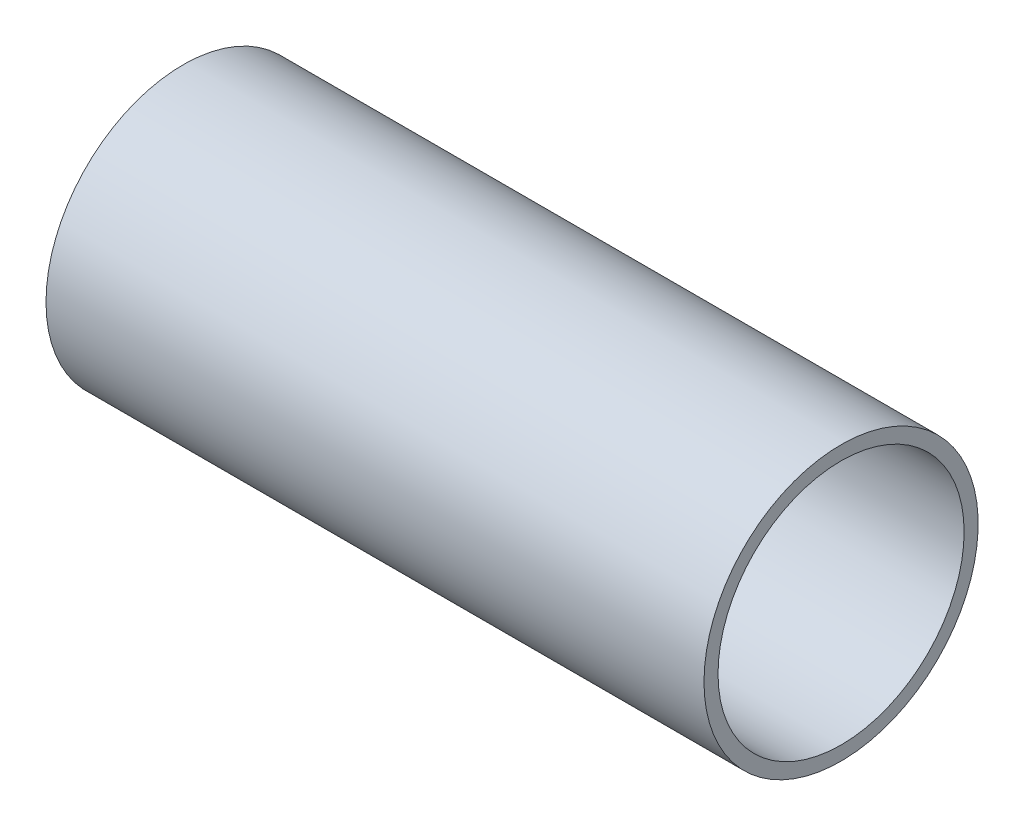
ISO-10303-21;
HEADER;
FILE_DESCRIPTION(('STEP AP214'),'2;1');
FILE_NAME('part.step','',(''),(''),'','','');
FILE_SCHEMA(('AUTOMOTIVE_DESIGN { 1 0 10303 214 1 1 1 1 }'));
ENDSEC;
DATA;
#1=APPLICATION_CONTEXT('core data for automotive mechanical design processes');
#2=APPLICATION_PROTOCOL_DEFINITION('international standard','automotive_design',2000,#1);
#3=PRODUCT_CONTEXT('',#1,'mechanical');
#4=PRODUCT('Part','Part','',(#3));
#5=PRODUCT_RELATED_PRODUCT_CATEGORY('part','',(#4));
#6=PRODUCT_DEFINITION_FORMATION('','',#4);
#7=PRODUCT_DEFINITION_CONTEXT('part definition',#1,'design');
#8=PRODUCT_DEFINITION('design','',#6,#7);
#9=PRODUCT_DEFINITION_SHAPE('','',#8);
#10=(LENGTH_UNIT() NAMED_UNIT(*) SI_UNIT(.MILLI.,.METRE.));
#11=(NAMED_UNIT(*) PLANE_ANGLE_UNIT() SI_UNIT($,.RADIAN.));
#12=(NAMED_UNIT(*) SI_UNIT($,.STERADIAN.) SOLID_ANGLE_UNIT());
#13=UNCERTAINTY_MEASURE_WITH_UNIT(LENGTH_MEASURE(1.E-05),#10,'distance_accuracy_value','');
#14=(GEOMETRIC_REPRESENTATION_CONTEXT(3) GLOBAL_UNCERTAINTY_ASSIGNED_CONTEXT((#13)) GLOBAL_UNIT_ASSIGNED_CONTEXT((#10,
#11,#12)) REPRESENTATION_CONTEXT('',''));
#15=CARTESIAN_POINT('',(0.,0.,0.));
#16=DIRECTION('',(0.,0.,1.));
#17=DIRECTION('',(1.,0.,0.));
#18=AXIS2_PLACEMENT_3D('',#15,#16,#17);
#19=CARTESIAN_POINT('',(76.2,0.,0.));
#20=DIRECTION('',(1.,0.,0.));
#21=DIRECTION('',(0.,0.,-1.));
#22=AXIS2_PLACEMENT_3D('',#19,#20,#21);
#23=PLANE('',#22);
#24=CARTESIAN_POINT('',(76.2,0.,0.));
#25=DIRECTION('',(1.,0.,0.));
#26=DIRECTION('',(0.,0.,-1.));
#27=AXIS2_PLACEMENT_3D('',#24,#25,#26);
#28=CIRCLE('',#27,15.875);
#29=CARTESIAN_POINT('',(76.2,0.,15.875));
#30=VERTEX_POINT('',#29);
#31=EDGE_CURVE('E10',#30,#30,#28,.T.);
#32=ORIENTED_EDGE('',*,*,#31,.T.);
#33=EDGE_LOOP('',(#32));
#34=FACE_BOUND('',#33,.T.);
#35=CARTESIAN_POINT('',(76.2,0.,0.));
#36=DIRECTION('',(1.,0.,0.));
#37=DIRECTION('',(0.,0.,-1.));
#38=AXIS2_PLACEMENT_3D('',#35,#36,#37);
#39=CIRCLE('',#38,14.25);
#40=CARTESIAN_POINT('',(76.2,0.,14.25));
#41=VERTEX_POINT('',#40);
#42=EDGE_CURVE('E44',#41,#41,#39,.T.);
#43=ORIENTED_EDGE('',*,*,#42,.F.);
#44=EDGE_LOOP('',(#43));
#45=FACE_BOUND('',#44,.T.);
#46=ADVANCED_FACE('F32',(#34,#45),#23,.T.);
#47=CARTESIAN_POINT('',(0.,0.,0.));
#48=DIRECTION('',(1.,0.,0.));
#49=DIRECTION('',(0.,0.,-1.));
#50=AXIS2_PLACEMENT_3D('',#47,#48,#49);
#51=PLANE('',#50);
#52=CARTESIAN_POINT('',(0.,0.,0.));
#53=DIRECTION('',(1.,0.,0.));
#54=DIRECTION('',(0.,0.,-1.));
#55=AXIS2_PLACEMENT_3D('',#52,#53,#54);
#56=CIRCLE('',#55,15.875);
#57=CARTESIAN_POINT('',(0.,0.,15.875));
#58=VERTEX_POINT('',#57);
#59=EDGE_CURVE('E36',#58,#58,#56,.T.);
#60=ORIENTED_EDGE('',*,*,#59,.F.);
#61=EDGE_LOOP('',(#60));
#62=FACE_BOUND('',#61,.T.);
#63=CARTESIAN_POINT('',(0.,0.,0.));
#64=DIRECTION('',(1.,0.,0.));
#65=DIRECTION('',(0.,0.,-1.));
#66=AXIS2_PLACEMENT_3D('',#63,#64,#65);
#67=CIRCLE('',#66,14.25);
#68=CARTESIAN_POINT('',(0.,0.,14.25));
#69=VERTEX_POINT('',#68);
#70=EDGE_CURVE('E46',#69,#69,#67,.T.);
#71=ORIENTED_EDGE('',*,*,#70,.T.);
#72=EDGE_LOOP('',(#71));
#73=FACE_BOUND('',#72,.T.);
#74=ADVANCED_FACE('F60',(#62,#73),#51,.F.);
#75=CARTESIAN_POINT('',(76.2,0.,0.));
#76=DIRECTION('',(-1.,0.,0.));
#77=DIRECTION('',(0.,0.,1.));
#78=AXIS2_PLACEMENT_3D('',#75,#76,#77);
#79=CYLINDRICAL_SURFACE('',#78,15.875);
#80=CARTESIAN_POINT('',(76.2,0.,15.875));
#81=CARTESIAN_POINT('',(75.40625,0.,15.875));
#82=CARTESIAN_POINT('',(74.6125,0.,15.875));
#83=CARTESIAN_POINT('',(73.025,0.,15.875));
#84=CARTESIAN_POINT('',(72.23125,0.,15.875));
#85=CARTESIAN_POINT('',(70.64375,0.,15.875));
#86=CARTESIAN_POINT('',(69.85,0.,15.875));
#87=CARTESIAN_POINT('',(68.2625,0.,15.875));
#88=CARTESIAN_POINT('',(67.46875,0.,15.875));
#89=CARTESIAN_POINT('',(65.88125,0.,15.875));
#90=CARTESIAN_POINT('',(65.0875,0.,15.875));
#91=CARTESIAN_POINT('',(63.5,0.,15.875));
#92=CARTESIAN_POINT('',(62.70625,0.,15.875));
#93=CARTESIAN_POINT('',(61.11875,0.,15.875));
#94=CARTESIAN_POINT('',(60.325,0.,15.875));
#95=CARTESIAN_POINT('',(58.7375,0.,15.875));
#96=CARTESIAN_POINT('',(57.94375,0.,15.875));
#97=CARTESIAN_POINT('',(56.35625,0.,15.875));
#98=CARTESIAN_POINT('',(55.5625,0.,15.875));
#99=CARTESIAN_POINT('',(53.975,0.,15.875));
#100=CARTESIAN_POINT('',(53.18125,0.,15.875));
#101=CARTESIAN_POINT('',(51.59375,0.,15.875));
#102=CARTESIAN_POINT('',(50.8,0.,15.875));
#103=CARTESIAN_POINT('',(49.2125,0.,15.875));
#104=CARTESIAN_POINT('',(48.41875,0.,15.875));
#105=CARTESIAN_POINT('',(46.83125,0.,15.875));
#106=CARTESIAN_POINT('',(46.0375,0.,15.875));
#107=CARTESIAN_POINT('',(44.45,0.,15.875));
#108=CARTESIAN_POINT('',(43.65625,0.,15.875));
#109=CARTESIAN_POINT('',(42.06875,0.,15.875));
#110=CARTESIAN_POINT('',(41.275,0.,15.875));
#111=CARTESIAN_POINT('',(39.6875,0.,15.875));
#112=CARTESIAN_POINT('',(38.89375,0.,15.875));
#113=CARTESIAN_POINT('',(37.30625,0.,15.875));
#114=CARTESIAN_POINT('',(36.5125,0.,15.875));
#115=CARTESIAN_POINT('',(34.925,0.,15.875));
#116=CARTESIAN_POINT('',(34.13125,0.,15.875));
#117=CARTESIAN_POINT('',(32.54375,0.,15.875));
#118=CARTESIAN_POINT('',(31.75,0.,15.875));
#119=CARTESIAN_POINT('',(30.1625,0.,15.875));
#120=CARTESIAN_POINT('',(29.36875,0.,15.875));
#121=CARTESIAN_POINT('',(27.78125,0.,15.875));
#122=CARTESIAN_POINT('',(26.9875,0.,15.875));
#123=CARTESIAN_POINT('',(25.4,0.,15.875));
#124=CARTESIAN_POINT('',(24.60625,0.,15.875));
#125=CARTESIAN_POINT('',(23.01875,0.,15.875));
#126=CARTESIAN_POINT('',(22.225,0.,15.875));
#127=CARTESIAN_POINT('',(20.6375,0.,15.875));
#128=CARTESIAN_POINT('',(19.84375,0.,15.875));
#129=CARTESIAN_POINT('',(18.25625,0.,15.875));
#130=CARTESIAN_POINT('',(17.4625,0.,15.875));
#131=CARTESIAN_POINT('',(15.875,0.,15.875));
#132=CARTESIAN_POINT('',(15.08125,0.,15.875));
#133=CARTESIAN_POINT('',(13.49375,0.,15.875));
#134=CARTESIAN_POINT('',(12.7,0.,15.875));
#135=CARTESIAN_POINT('',(11.1125,0.,15.875));
#136=CARTESIAN_POINT('',(10.31875,0.,15.875));
#137=CARTESIAN_POINT('',(8.73125,0.,15.875));
#138=CARTESIAN_POINT('',(7.93750000000001,0.,15.875));
#139=CARTESIAN_POINT('',(6.35,0.,15.875));
#140=CARTESIAN_POINT('',(5.55625,0.,15.875));
#141=CARTESIAN_POINT('',(3.96875,0.,15.875));
#142=CARTESIAN_POINT('',(3.175,0.,15.875));
#143=CARTESIAN_POINT('',(1.5875,0.,15.875));
#144=CARTESIAN_POINT('',(0.793750000000001,0.,15.875));
#145=CARTESIAN_POINT('',(0.,0.,15.875));
#146=B_SPLINE_CURVE_WITH_KNOTS('',3,(#80,#81,#82,#83,#84,#85,#86,#87,#88,#89,#90,#91,#92,#93,
#94,#95,#96,#97,#98,#99,#100,#101,#102,#103,#104,#105,#106,#107,#108,#109,#110,#111,#112,#113,
#114,#115,#116,#117,#118,#119,#120,#121,#122,#123,#124,#125,#126,#127,#128,#129,#130,#131,#132,
#133,#134,#135,#136,#137,#138,#139,#140,#141,#142,#143,#144,#145),.UNSPECIFIED.,.F.,.F.,(4,2,2,
2,2,2,2,2,2,2,2,2,2,2,2,2,2,2,2,2,2,2,2,2,2,2,2,2,2,2,2,2,4),(0.,2.38125,4.7625,7.14375,
9.52500000000001,11.90625,14.2875,16.66875,19.05,21.43125,23.8125,26.19375,28.575,30.95625,
33.3375,35.71875,38.1,40.48125,42.8625,45.24375,47.625,50.00625,52.3875,54.76875,57.15,59.53125,
61.9125,64.29375,66.675,69.05625,71.4375,73.81875,76.2),.UNSPECIFIED.);
#147=EDGE_CURVE('BSEAM34',#30,#58,#146,.T.);
#148=ORIENTED_EDGE('',*,*,#31,.F.);
#149=ORIENTED_EDGE('',*,*,#59,.T.);
#150=ORIENTED_EDGE('',*,*,#147,.T.);
#151=ORIENTED_EDGE('',*,*,#147,.F.);
#152=EDGE_LOOP('',(#148,#150,#149,#151));
#153=FACE_BOUND('',#152,.T.);
#154=ADVANCED_FACE('F34',(#153),#79,.T.);
#155=CARTESIAN_POINT('',(76.2,0.,0.));
#156=DIRECTION('',(-1.,0.,0.));
#157=DIRECTION('',(0.,0.,1.));
#158=AXIS2_PLACEMENT_3D('',#155,#156,#157);
#159=CYLINDRICAL_SURFACE('',#158,14.25);
#160=CARTESIAN_POINT('',(76.2,0.,14.25));
#161=CARTESIAN_POINT('',(75.40625,0.,14.25));
#162=CARTESIAN_POINT('',(74.6125,0.,14.25));
#163=CARTESIAN_POINT('',(73.025,0.,14.25));
#164=CARTESIAN_POINT('',(72.23125,0.,14.25));
#165=CARTESIAN_POINT('',(70.64375,0.,14.25));
#166=CARTESIAN_POINT('',(69.85,0.,14.25));
#167=CARTESIAN_POINT('',(68.2625,0.,14.25));
#168=CARTESIAN_POINT('',(67.46875,0.,14.25));
#169=CARTESIAN_POINT('',(65.88125,0.,14.25));
#170=CARTESIAN_POINT('',(65.0875,0.,14.25));
#171=CARTESIAN_POINT('',(63.5,0.,14.25));
#172=CARTESIAN_POINT('',(62.70625,0.,14.25));
#173=CARTESIAN_POINT('',(61.11875,0.,14.25));
#174=CARTESIAN_POINT('',(60.325,0.,14.25));
#175=CARTESIAN_POINT('',(58.7375,0.,14.25));
#176=CARTESIAN_POINT('',(57.94375,0.,14.25));
#177=CARTESIAN_POINT('',(56.35625,0.,14.25));
#178=CARTESIAN_POINT('',(55.5625,0.,14.25));
#179=CARTESIAN_POINT('',(53.975,0.,14.25));
#180=CARTESIAN_POINT('',(53.18125,0.,14.25));
#181=CARTESIAN_POINT('',(51.59375,0.,14.25));
#182=CARTESIAN_POINT('',(50.8,0.,14.25));
#183=CARTESIAN_POINT('',(49.2125,0.,14.25));
#184=CARTESIAN_POINT('',(48.41875,0.,14.25));
#185=CARTESIAN_POINT('',(46.83125,0.,14.25));
#186=CARTESIAN_POINT('',(46.0375,0.,14.25));
#187=CARTESIAN_POINT('',(44.45,0.,14.25));
#188=CARTESIAN_POINT('',(43.65625,0.,14.25));
#189=CARTESIAN_POINT('',(42.06875,0.,14.25));
#190=CARTESIAN_POINT('',(41.275,0.,14.25));
#191=CARTESIAN_POINT('',(39.6875,0.,14.25));
#192=CARTESIAN_POINT('',(38.89375,0.,14.25));
#193=CARTESIAN_POINT('',(37.30625,0.,14.25));
#194=CARTESIAN_POINT('',(36.5125,0.,14.25));
#195=CARTESIAN_POINT('',(34.925,0.,14.25));
#196=CARTESIAN_POINT('',(34.13125,0.,14.25));
#197=CARTESIAN_POINT('',(32.54375,0.,14.25));
#198=CARTESIAN_POINT('',(31.75,0.,14.25));
#199=CARTESIAN_POINT('',(30.1625,0.,14.25));
#200=CARTESIAN_POINT('',(29.36875,0.,14.25));
#201=CARTESIAN_POINT('',(27.78125,0.,14.25));
#202=CARTESIAN_POINT('',(26.9875,0.,14.25));
#203=CARTESIAN_POINT('',(25.4,0.,14.25));
#204=CARTESIAN_POINT('',(24.60625,0.,14.25));
#205=CARTESIAN_POINT('',(23.01875,0.,14.25));
#206=CARTESIAN_POINT('',(22.225,0.,14.25));
#207=CARTESIAN_POINT('',(20.6375,0.,14.25));
#208=CARTESIAN_POINT('',(19.84375,0.,14.25));
#209=CARTESIAN_POINT('',(18.25625,0.,14.25));
#210=CARTESIAN_POINT('',(17.4625,0.,14.25));
#211=CARTESIAN_POINT('',(15.875,0.,14.25));
#212=CARTESIAN_POINT('',(15.08125,0.,14.25));
#213=CARTESIAN_POINT('',(13.49375,0.,14.25));
#214=CARTESIAN_POINT('',(12.7,0.,14.25));
#215=CARTESIAN_POINT('',(11.1125,0.,14.25));
#216=CARTESIAN_POINT('',(10.31875,0.,14.25));
#217=CARTESIAN_POINT('',(8.73125,0.,14.25));
#218=CARTESIAN_POINT('',(7.93750000000001,0.,14.25));
#219=CARTESIAN_POINT('',(6.35,0.,14.25));
#220=CARTESIAN_POINT('',(5.55625,0.,14.25));
#221=CARTESIAN_POINT('',(3.96875,0.,14.25));
#222=CARTESIAN_POINT('',(3.175,0.,14.25));
#223=CARTESIAN_POINT('',(1.5875,0.,14.25));
#224=CARTESIAN_POINT('',(0.793750000000001,0.,14.25));
#225=CARTESIAN_POINT('',(0.,0.,14.25));
#226=B_SPLINE_CURVE_WITH_KNOTS('',3,(#160,#161,#162,#163,#164,#165,#166,#167,#168,#169,#170,
#171,#172,#173,#174,#175,#176,#177,#178,#179,#180,#181,#182,#183,#184,#185,#186,#187,#188,#189,
#190,#191,#192,#193,#194,#195,#196,#197,#198,#199,#200,#201,#202,#203,#204,#205,#206,#207,#208,
#209,#210,#211,#212,#213,#214,#215,#216,#217,#218,#219,#220,#221,#222,#223,#224,#225),
.UNSPECIFIED.,.F.,.F.,(4,2,2,2,2,2,2,2,2,2,2,2,2,2,2,2,2,2,2,2,2,2,2,2,2,2,2,2,2,2,2,2,4),(0.,
2.38125,4.7625,7.14375,9.52500000000001,11.90625,14.2875,16.66875,19.05,21.43125,23.8125,
26.19375,28.575,30.95625,33.3375,35.71875,38.1,40.48125,42.8625,45.24375,47.625,50.00625,
52.3875,54.76875,57.15,59.53125,61.9125,64.29375,66.675,69.05625,71.4375,73.81875,76.2),.UNSPECIFIED.);
#227=EDGE_CURVE('BSEAM56',#41,#69,#226,.T.);
#228=ORIENTED_EDGE('',*,*,#42,.T.);
#229=ORIENTED_EDGE('',*,*,#70,.F.);
#230=ORIENTED_EDGE('',*,*,#227,.T.);
#231=ORIENTED_EDGE('',*,*,#227,.F.);
#232=EDGE_LOOP('',(#228,#230,#229,#231));
#233=FACE_BOUND('',#232,.T.);
#234=ADVANCED_FACE('F56',(#233),#159,.F.);
#235=CLOSED_SHELL('',(#46,#74,#154,#234));
#236=MANIFOLD_SOLID_BREP('B2',#235);
#237=ADVANCED_BREP_SHAPE_REPRESENTATION('',(#18,#236),#14);
#238=SHAPE_DEFINITION_REPRESENTATION(#9,#237);
ENDSEC;
END-ISO-10303-21;
